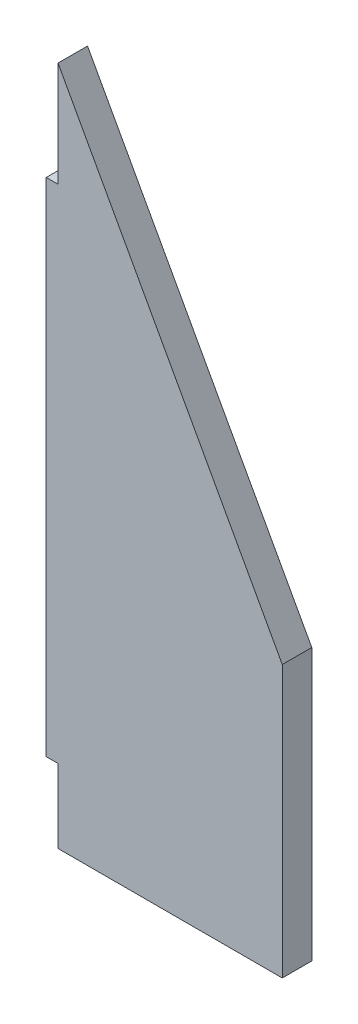
ISO-10303-21;
HEADER;
FILE_DESCRIPTION(('STEP AP214'),'2;1');
FILE_NAME('part.step','',(''),(''),'','','');
FILE_SCHEMA(('AUTOMOTIVE_DESIGN { 1 0 10303 214 1 1 1 1 }'));
ENDSEC;
DATA;
#1=APPLICATION_CONTEXT('core data for automotive mechanical design processes');
#2=APPLICATION_PROTOCOL_DEFINITION('international standard','automotive_design',2000,#1);
#3=PRODUCT_CONTEXT('',#1,'mechanical');
#4=PRODUCT('Part','Part','',(#3));
#5=PRODUCT_RELATED_PRODUCT_CATEGORY('part','',(#4));
#6=PRODUCT_DEFINITION_FORMATION('','',#4);
#7=PRODUCT_DEFINITION_CONTEXT('part definition',#1,'design');
#8=PRODUCT_DEFINITION('design','',#6,#7);
#9=PRODUCT_DEFINITION_SHAPE('','',#8);
#10=(LENGTH_UNIT() NAMED_UNIT(*) SI_UNIT(.MILLI.,.METRE.));
#11=(NAMED_UNIT(*) PLANE_ANGLE_UNIT() SI_UNIT($,.RADIAN.));
#12=(NAMED_UNIT(*) SI_UNIT($,.STERADIAN.) SOLID_ANGLE_UNIT());
#13=UNCERTAINTY_MEASURE_WITH_UNIT(LENGTH_MEASURE(1.E-05),#10,'distance_accuracy_value','');
#14=(GEOMETRIC_REPRESENTATION_CONTEXT(3) GLOBAL_UNCERTAINTY_ASSIGNED_CONTEXT((#13)) GLOBAL_UNIT_ASSIGNED_CONTEXT((#10,
#11,#12)) REPRESENTATION_CONTEXT('',''));
#15=CARTESIAN_POINT('',(0.,0.,0.));
#16=DIRECTION('',(0.,0.,1.));
#17=DIRECTION('',(1.,0.,0.));
#18=AXIS2_PLACEMENT_3D('',#15,#16,#17);
#19=CARTESIAN_POINT('',(-2.32839165217279,123.800315582831,6.35));
#20=DIRECTION('',(1.,0.,0.));
#21=DIRECTION('',(0.,1.,0.));
#22=AXIS2_PLACEMENT_3D('',#19,#20,#21);
#23=PLANE('',#22);
#24=DIRECTION('',(0.,-1.,0.));
#25=VECTOR('',#24,1.);
#26=CARTESIAN_POINT('',(-2.32839165217279,123.800315582831,0.));
#27=LINE('',#26,#25);
#28=CARTESIAN_POINT('',(-2.32839165217279,123.800315582831,0.));
#29=VERTEX_POINT('',#28);
#30=CARTESIAN_POINT('',(-2.32839165217277,15.8503155828312,0.));
#31=VERTEX_POINT('',#30);
#32=EDGE_CURVE('E140',#29,#31,#27,.T.);
#33=ORIENTED_EDGE('',*,*,#32,.T.);
#34=DIRECTION('',(0.,0.,-1.));
#35=VECTOR('',#34,1.);
#36=CARTESIAN_POINT('',(-2.32839165217277,15.8503155828312,6.35));
#37=LINE('',#36,#35);
#38=CARTESIAN_POINT('',(-2.32839165217277,15.8503155828312,6.35));
#39=VERTEX_POINT('',#38);
#40=EDGE_CURVE('E11',#39,#31,#37,.T.);
#41=ORIENTED_EDGE('',*,*,#40,.F.);
#42=DIRECTION('',(0.,-1.,0.));
#43=VECTOR('',#42,1.);
#44=CARTESIAN_POINT('',(-2.32839165217279,123.800315582831,6.35));
#45=LINE('',#44,#43);
#46=CARTESIAN_POINT('',(-2.32839165217279,123.800315582831,6.35));
#47=VERTEX_POINT('',#46);
#48=EDGE_CURVE('E162',#47,#39,#45,.T.);
#49=ORIENTED_EDGE('',*,*,#48,.F.);
#50=DIRECTION('',(0.,0.,-1.));
#51=VECTOR('',#50,1.);
#52=CARTESIAN_POINT('',(-2.32839165217279,123.800315582831,6.35));
#53=LINE('',#52,#51);
#54=EDGE_CURVE('E136',#47,#29,#53,.T.);
#55=ORIENTED_EDGE('',*,*,#54,.T.);
#56=EDGE_LOOP('',(#33,#41,#49,#55));
#57=FACE_BOUND('',#56,.T.);
#58=ADVANCED_FACE('F39',(#57),#23,.F.);
#59=CARTESIAN_POINT('',(-2.32839165217277,15.8503155828312,6.35));
#60=DIRECTION('',(0.,1.,0.));
#61=DIRECTION('',(0.,0.,1.));
#62=AXIS2_PLACEMENT_3D('',#59,#60,#61);
#63=PLANE('',#62);
#64=DIRECTION('',(1.,0.,0.));
#65=VECTOR('',#64,1.);
#66=CARTESIAN_POINT('',(-2.32839165217277,15.8503155828312,0.));
#67=LINE('',#66,#65);
#68=CARTESIAN_POINT('',(0.211608347827226,15.8503155828312,0.));
#69=VERTEX_POINT('',#68);
#70=EDGE_CURVE('E144',#31,#69,#67,.T.);
#71=ORIENTED_EDGE('',*,*,#70,.T.);
#72=DIRECTION('',(0.,0.,-1.));
#73=VECTOR('',#72,1.);
#74=CARTESIAN_POINT('',(0.211608347827226,15.8503155828312,6.35));
#75=LINE('',#74,#73);
#76=CARTESIAN_POINT('',(0.211608347827226,15.8503155828312,6.35));
#77=VERTEX_POINT('',#76);
#78=EDGE_CURVE('E48',#77,#69,#75,.T.);
#79=ORIENTED_EDGE('',*,*,#78,.F.);
#80=DIRECTION('',(1.,0.,0.));
#81=VECTOR('',#80,1.);
#82=CARTESIAN_POINT('',(-2.32839165217277,15.8503155828312,6.35));
#83=LINE('',#82,#81);
#84=EDGE_CURVE('E99',#39,#77,#83,.T.);
#85=ORIENTED_EDGE('',*,*,#84,.F.);
#86=ORIENTED_EDGE('',*,*,#40,.T.);
#87=EDGE_LOOP('',(#71,#79,#85,#86));
#88=FACE_BOUND('',#87,.T.);
#89=ADVANCED_FACE('F208',(#88),#63,.F.);
#90=CARTESIAN_POINT('',(0.211608347827226,15.8503155828312,6.35));
#91=DIRECTION('',(1.,0.,0.));
#92=DIRECTION('',(0.,1.,0.));
#93=AXIS2_PLACEMENT_3D('',#90,#91,#92);
#94=PLANE('',#93);
#95=DIRECTION('',(0.,-1.,0.));
#96=VECTOR('',#95,1.);
#97=CARTESIAN_POINT('',(0.211608347827226,15.8503155828312,0.));
#98=LINE('',#97,#96);
#99=CARTESIAN_POINT('',(0.211608347827228,0.,0.));
#100=VERTEX_POINT('',#99);
#101=EDGE_CURVE('E147',#69,#100,#98,.T.);
#102=ORIENTED_EDGE('',*,*,#101,.T.);
#103=DIRECTION('',(0.,0.,-1.));
#104=VECTOR('',#103,1.);
#105=CARTESIAN_POINT('',(0.211608347827228,0.,6.35));
#106=LINE('',#105,#104);
#107=CARTESIAN_POINT('',(0.211608347827228,0.,6.35));
#108=VERTEX_POINT('',#107);
#109=EDGE_CURVE('E173',#108,#100,#106,.T.);
#110=ORIENTED_EDGE('',*,*,#109,.F.);
#111=DIRECTION('',(0.,-1.,0.));
#112=VECTOR('',#111,1.);
#113=CARTESIAN_POINT('',(0.211608347827226,15.8503155828312,6.35));
#114=LINE('',#113,#112);
#115=EDGE_CURVE('E183',#77,#108,#114,.T.);
#116=ORIENTED_EDGE('',*,*,#115,.F.);
#117=ORIENTED_EDGE('',*,*,#78,.T.);
#118=EDGE_LOOP('',(#102,#110,#116,#117));
#119=FACE_BOUND('',#118,.T.);
#120=ADVANCED_FACE('F181',(#119),#94,.F.);
#121=CARTESIAN_POINT('',(0.211608347827228,0.,6.35));
#122=DIRECTION('',(0.,1.,0.));
#123=DIRECTION('',(0.,0.,1.));
#124=AXIS2_PLACEMENT_3D('',#121,#122,#123);
#125=PLANE('',#124);
#126=DIRECTION('',(1.,0.,0.));
#127=VECTOR('',#126,1.);
#128=CARTESIAN_POINT('',(0.211608347827228,0.,0.));
#129=LINE('',#128,#127);
#130=CARTESIAN_POINT('',(48.4716083478272,0.,0.));
#131=VERTEX_POINT('',#130);
#132=EDGE_CURVE('E150',#100,#131,#129,.T.);
#133=ORIENTED_EDGE('',*,*,#132,.T.);
#134=DIRECTION('',(0.,0.,-1.));
#135=VECTOR('',#134,1.);
#136=CARTESIAN_POINT('',(48.4716083478272,0.,6.35));
#137=LINE('',#136,#135);
#138=CARTESIAN_POINT('',(48.4716083478272,0.,6.35));
#139=VERTEX_POINT('',#138);
#140=EDGE_CURVE('E169',#139,#131,#137,.T.);
#141=ORIENTED_EDGE('',*,*,#140,.F.);
#142=DIRECTION('',(1.,0.,0.));
#143=VECTOR('',#142,1.);
#144=CARTESIAN_POINT('',(0.211608347827228,0.,6.35));
#145=LINE('',#144,#143);
#146=EDGE_CURVE('E196',#108,#139,#145,.T.);
#147=ORIENTED_EDGE('',*,*,#146,.F.);
#148=ORIENTED_EDGE('',*,*,#109,.T.);
#149=EDGE_LOOP('',(#133,#141,#147,#148));
#150=FACE_BOUND('',#149,.T.);
#151=ADVANCED_FACE('F191',(#150),#125,.F.);
#152=CARTESIAN_POINT('',(48.4716083478272,0.,6.35));
#153=DIRECTION('',(-1.,0.,0.));
#154=DIRECTION('',(0.,0.,1.));
#155=AXIS2_PLACEMENT_3D('',#152,#153,#154);
#156=PLANE('',#155);
#157=DIRECTION('',(0.,1.,0.));
#158=VECTOR('',#157,1.);
#159=CARTESIAN_POINT('',(48.4716083478272,0.,0.));
#160=LINE('',#159,#158);
#161=CARTESIAN_POINT('',(48.4716083478272,58.42,0.));
#162=VERTEX_POINT('',#161);
#163=EDGE_CURVE('E153',#131,#162,#160,.T.);
#164=ORIENTED_EDGE('',*,*,#163,.T.);
#165=DIRECTION('',(0.,0.,-1.));
#166=VECTOR('',#165,1.);
#167=CARTESIAN_POINT('',(48.4716083478272,58.42,6.35));
#168=LINE('',#167,#166);
#169=CARTESIAN_POINT('',(48.4716083478272,58.42,6.35));
#170=VERTEX_POINT('',#169);
#171=EDGE_CURVE('E129',#170,#162,#168,.T.);
#172=ORIENTED_EDGE('',*,*,#171,.F.);
#173=DIRECTION('',(0.,1.,0.));
#174=VECTOR('',#173,1.);
#175=CARTESIAN_POINT('',(48.4716083478272,0.,6.35));
#176=LINE('',#175,#174);
#177=EDGE_CURVE('E118',#139,#170,#176,.T.);
#178=ORIENTED_EDGE('',*,*,#177,.F.);
#179=ORIENTED_EDGE('',*,*,#140,.T.);
#180=EDGE_LOOP('',(#164,#172,#178,#179));
#181=FACE_BOUND('',#180,.T.);
#182=ADVANCED_FACE('F194',(#181),#156,.F.);
#183=CARTESIAN_POINT('',(48.4716083478272,58.42,6.35));
#184=DIRECTION('',(-0.876738569385036,-0.480967234801581,0.));
#185=DIRECTION('',(0.480967234801581,-0.876738569385036,0.));
#186=AXIS2_PLACEMENT_3D('',#183,#184,#185);
#187=PLANE('',#186);
#188=DIRECTION('',(-0.480967234801581,0.876738569385036,0.));
#189=VECTOR('',#188,1.);
#190=CARTESIAN_POINT('',(48.4716083478272,58.42,0.));
#191=LINE('',#190,#189);
#192=CARTESIAN_POINT('',(0.21160834782721,146.391488070236,0.));
#193=VERTEX_POINT('',#192);
#194=EDGE_CURVE('E127',#162,#193,#191,.T.);
#195=ORIENTED_EDGE('',*,*,#194,.T.);
#196=DIRECTION('',(0.,0.,-1.));
#197=VECTOR('',#196,1.);
#198=CARTESIAN_POINT('',(0.21160834782721,146.391488070236,6.35));
#199=LINE('',#198,#197);
#200=CARTESIAN_POINT('',(0.21160834782721,146.391488070236,6.35));
#201=VERTEX_POINT('',#200);
#202=EDGE_CURVE('E124',#201,#193,#199,.T.);
#203=ORIENTED_EDGE('',*,*,#202,.F.);
#204=DIRECTION('',(-0.480967234801581,0.876738569385036,0.));
#205=VECTOR('',#204,1.);
#206=CARTESIAN_POINT('',(48.4716083478272,58.42,6.35));
#207=LINE('',#206,#205);
#208=EDGE_CURVE('E112',#170,#201,#207,.T.);
#209=ORIENTED_EDGE('',*,*,#208,.F.);
#210=ORIENTED_EDGE('',*,*,#171,.T.);
#211=EDGE_LOOP('',(#195,#203,#209,#210));
#212=FACE_BOUND('',#211,.T.);
#213=ADVANCED_FACE('F125',(#212),#187,.F.);
#214=CARTESIAN_POINT('',(0.21160834782721,146.391488070236,6.35));
#215=DIRECTION('',(1.,0.,0.));
#216=DIRECTION('',(0.,1.,0.));
#217=AXIS2_PLACEMENT_3D('',#214,#215,#216);
#218=PLANE('',#217);
#219=DIRECTION('',(0.,-1.,0.));
#220=VECTOR('',#219,1.);
#221=CARTESIAN_POINT('',(0.21160834782721,146.391488070236,0.));
#222=LINE('',#221,#220);
#223=CARTESIAN_POINT('',(0.211608347827213,123.800315582831,0.));
#224=VERTEX_POINT('',#223);
#225=EDGE_CURVE('E85',#193,#224,#222,.T.);
#226=ORIENTED_EDGE('',*,*,#225,.T.);
#227=DIRECTION('',(0.,0.,-1.));
#228=VECTOR('',#227,1.);
#229=CARTESIAN_POINT('',(0.211608347827213,123.800315582831,6.35));
#230=LINE('',#229,#228);
#231=CARTESIAN_POINT('',(0.211608347827213,123.800315582831,6.35));
#232=VERTEX_POINT('',#231);
#233=EDGE_CURVE('E130',#232,#224,#230,.T.);
#234=ORIENTED_EDGE('',*,*,#233,.F.);
#235=DIRECTION('',(0.,-1.,0.));
#236=VECTOR('',#235,1.);
#237=CARTESIAN_POINT('',(0.21160834782721,146.391488070236,6.35));
#238=LINE('',#237,#236);
#239=EDGE_CURVE('E116',#201,#232,#238,.T.);
#240=ORIENTED_EDGE('',*,*,#239,.F.);
#241=ORIENTED_EDGE('',*,*,#202,.T.);
#242=EDGE_LOOP('',(#226,#234,#240,#241));
#243=FACE_BOUND('',#242,.T.);
#244=ADVANCED_FACE('F132',(#243),#218,.F.);
#245=CARTESIAN_POINT('',(0.211608347827213,123.800315582831,6.35));
#246=DIRECTION('',(0.,-1.,0.));
#247=DIRECTION('',(0.,0.,-1.));
#248=AXIS2_PLACEMENT_3D('',#245,#246,#247);
#249=PLANE('',#248);
#250=DIRECTION('',(-1.,0.,0.));
#251=VECTOR('',#250,1.);
#252=CARTESIAN_POINT('',(0.211608347827213,123.800315582831,0.));
#253=LINE('',#252,#251);
#254=EDGE_CURVE('E91',#224,#29,#253,.T.);
#255=ORIENTED_EDGE('',*,*,#254,.T.);
#256=ORIENTED_EDGE('',*,*,#54,.F.);
#257=DIRECTION('',(-1.,0.,0.));
#258=VECTOR('',#257,1.);
#259=CARTESIAN_POINT('',(0.211608347827213,123.800315582831,6.35));
#260=LINE('',#259,#258);
#261=EDGE_CURVE('E56',#232,#47,#260,.T.);
#262=ORIENTED_EDGE('',*,*,#261,.F.);
#263=ORIENTED_EDGE('',*,*,#233,.T.);
#264=EDGE_LOOP('',(#255,#256,#262,#263));
#265=FACE_BOUND('',#264,.T.);
#266=ADVANCED_FACE('F224',(#265),#249,.F.);
#267=CARTESIAN_POINT('',(0.,0.,6.35));
#268=DIRECTION('',(0.,0.,1.));
#269=DIRECTION('',(1.,0.,0.));
#270=AXIS2_PLACEMENT_3D('',#267,#268,#269);
#271=PLANE('',#270);
#272=ORIENTED_EDGE('',*,*,#48,.T.);
#273=ORIENTED_EDGE('',*,*,#84,.T.);
#274=ORIENTED_EDGE('',*,*,#115,.T.);
#275=ORIENTED_EDGE('',*,*,#146,.T.);
#276=ORIENTED_EDGE('',*,*,#177,.T.);
#277=ORIENTED_EDGE('',*,*,#208,.T.);
#278=ORIENTED_EDGE('',*,*,#239,.T.);
#279=ORIENTED_EDGE('',*,*,#261,.T.);
#280=EDGE_LOOP('',(#272,#273,#274,#275,#276,#277,#278,#279));
#281=FACE_BOUND('',#280,.T.);
#282=ADVANCED_FACE('F114',(#281),#271,.T.);
#283=CARTESIAN_POINT('',(0.,0.,0.));
#284=DIRECTION('',(0.,0.,1.));
#285=DIRECTION('',(1.,0.,0.));
#286=AXIS2_PLACEMENT_3D('',#283,#284,#285);
#287=PLANE('',#286);
#288=ORIENTED_EDGE('',*,*,#32,.F.);
#289=ORIENTED_EDGE('',*,*,#254,.F.);
#290=ORIENTED_EDGE('',*,*,#225,.F.);
#291=ORIENTED_EDGE('',*,*,#194,.F.);
#292=ORIENTED_EDGE('',*,*,#163,.F.);
#293=ORIENTED_EDGE('',*,*,#132,.F.);
#294=ORIENTED_EDGE('',*,*,#101,.F.);
#295=ORIENTED_EDGE('',*,*,#70,.F.);
#296=EDGE_LOOP('',(#288,#289,#290,#291,#292,#293,#294,#295));
#297=FACE_BOUND('',#296,.T.);
#298=ADVANCED_FACE('F187',(#297),#287,.F.);
#299=CLOSED_SHELL('',(#58,#89,#120,#151,#182,#213,#244,#266,#282,#298));
#300=MANIFOLD_SOLID_BREP('B2',#299);
#301=ADVANCED_BREP_SHAPE_REPRESENTATION('',(#18,#300),#14);
#302=SHAPE_DEFINITION_REPRESENTATION(#9,#301);
ENDSEC;
END-ISO-10303-21;
